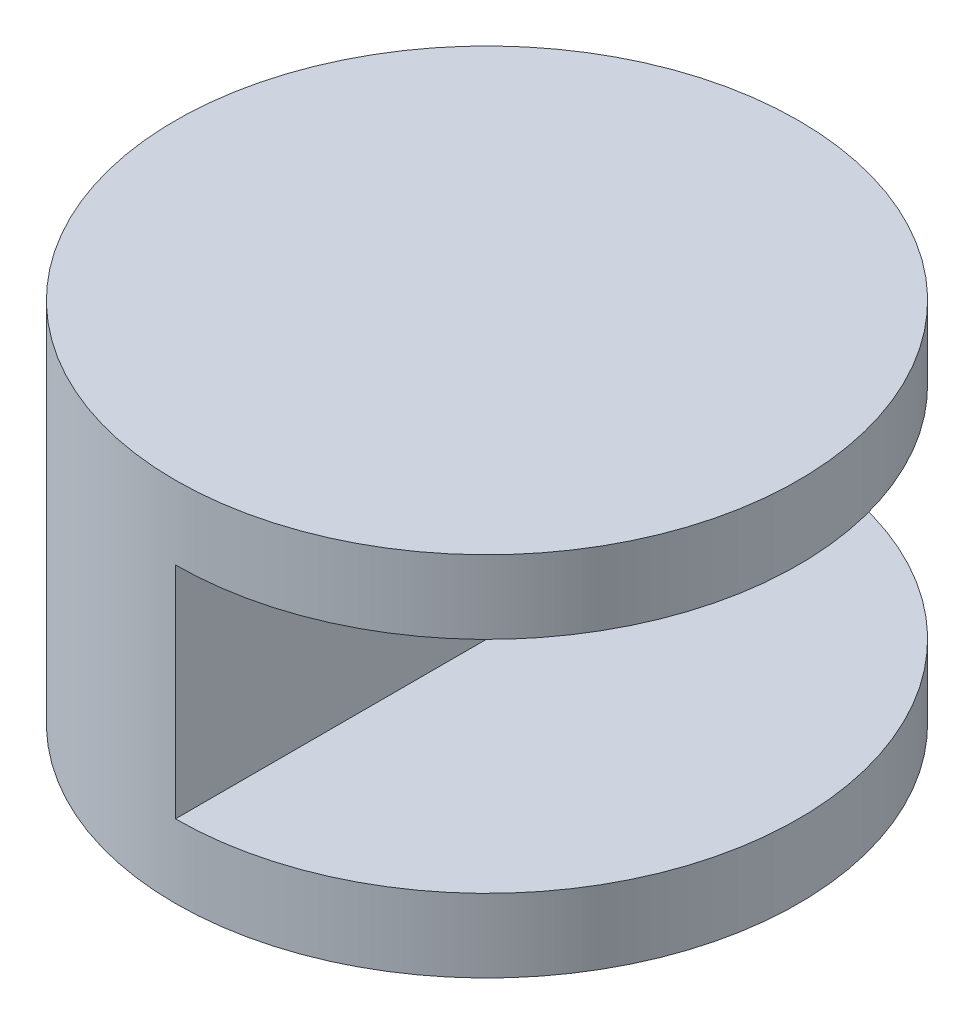
ISO-10303-21;
HEADER;
FILE_DESCRIPTION(('STEP AP214'),'2;1');
FILE_NAME('part.step','',(''),(''),'','','');
FILE_SCHEMA(('AUTOMOTIVE_DESIGN { 1 0 10303 214 1 1 1 1 }'));
ENDSEC;
DATA;
#1=APPLICATION_CONTEXT('core data for automotive mechanical design processes');
#2=APPLICATION_PROTOCOL_DEFINITION('international standard','automotive_design',2000,#1);
#3=PRODUCT_CONTEXT('',#1,'mechanical');
#4=PRODUCT('Part','Part','',(#3));
#5=PRODUCT_RELATED_PRODUCT_CATEGORY('part','',(#4));
#6=PRODUCT_DEFINITION_FORMATION('','',#4);
#7=PRODUCT_DEFINITION_CONTEXT('part definition',#1,'design');
#8=PRODUCT_DEFINITION('design','',#6,#7);
#9=PRODUCT_DEFINITION_SHAPE('','',#8);
#10=(LENGTH_UNIT() NAMED_UNIT(*) SI_UNIT(.MILLI.,.METRE.));
#11=(NAMED_UNIT(*) PLANE_ANGLE_UNIT() SI_UNIT($,.RADIAN.));
#12=(NAMED_UNIT(*) SI_UNIT($,.STERADIAN.) SOLID_ANGLE_UNIT());
#13=UNCERTAINTY_MEASURE_WITH_UNIT(LENGTH_MEASURE(1.E-05),#10,'distance_accuracy_value','');
#14=(GEOMETRIC_REPRESENTATION_CONTEXT(3) GLOBAL_UNCERTAINTY_ASSIGNED_CONTEXT((#13)) GLOBAL_UNIT_ASSIGNED_CONTEXT((#10,
#11,#12)) REPRESENTATION_CONTEXT('',''));
#15=CARTESIAN_POINT('',(0.,0.,0.));
#16=DIRECTION('',(0.,0.,1.));
#17=DIRECTION('',(1.,0.,0.));
#18=AXIS2_PLACEMENT_3D('',#15,#16,#17);
#19=CARTESIAN_POINT('',(0.,-12.7,0.));
#20=DIRECTION('',(0.,1.,0.));
#21=DIRECTION('',(0.,0.,1.));
#22=AXIS2_PLACEMENT_3D('',#19,#20,#21);
#23=CYLINDRICAL_SURFACE('',#22,10.795);
#24=DIRECTION('',(0.,1.,0.));
#25=VECTOR('',#24,1.);
#26=CARTESIAN_POINT('',(0.,-12.7,10.795));
#27=LINE('',#26,#25);
#28=CARTESIAN_POINT('',(0.,-2.54,10.795));
#29=VERTEX_POINT('',#28);
#30=CARTESIAN_POINT('',(0.,-10.16,10.795));
#31=VERTEX_POINT('',#30);
#32=EDGE_CURVE('E11',#29,#31,#27,.F.);
#33=ORIENTED_EDGE('',*,*,#32,.F.);
#34=CARTESIAN_POINT('',(0.,-2.54,0.));
#35=DIRECTION('',(0.,1.,0.));
#36=DIRECTION('',(0.,0.,1.));
#37=AXIS2_PLACEMENT_3D('',#34,#35,#36);
#38=CIRCLE('',#37,10.795);
#39=CARTESIAN_POINT('',(0.,-2.54,-10.795));
#40=VERTEX_POINT('',#39);
#41=EDGE_CURVE('E41',#40,#29,#38,.F.);
#42=ORIENTED_EDGE('',*,*,#41,.F.);
#43=DIRECTION('',(0.,1.,0.));
#44=VECTOR('',#43,1.);
#45=CARTESIAN_POINT('',(0.,-12.7,-10.795));
#46=LINE('',#45,#44);
#47=CARTESIAN_POINT('',(0.,-10.16,-10.795));
#48=VERTEX_POINT('',#47);
#49=EDGE_CURVE('E66',#48,#40,#46,.T.);
#50=ORIENTED_EDGE('',*,*,#49,.F.);
#51=CARTESIAN_POINT('',(0.,-10.16,0.));
#52=DIRECTION('',(0.,1.,0.));
#53=DIRECTION('',(0.,0.,1.));
#54=AXIS2_PLACEMENT_3D('',#51,#52,#53);
#55=CIRCLE('',#54,10.795);
#56=EDGE_CURVE('E54',#48,#31,#55,.F.);
#57=ORIENTED_EDGE('',*,*,#56,.T.);
#58=EDGE_LOOP('',(#33,#42,#50,#57));
#59=FACE_BOUND('',#58,.T.);
#60=CARTESIAN_POINT('',(0.,-12.7,0.));
#61=DIRECTION('',(0.,1.,0.));
#62=DIRECTION('',(0.,0.,1.));
#63=AXIS2_PLACEMENT_3D('',#60,#61,#62);
#64=CIRCLE('',#63,10.795);
#65=CARTESIAN_POINT('',(0.,-12.7,10.795));
#66=VERTEX_POINT('',#65);
#67=EDGE_CURVE('E74',#66,#66,#64,.T.);
#68=ORIENTED_EDGE('',*,*,#67,.T.);
#69=EDGE_LOOP('',(#68));
#70=FACE_BOUND('',#69,.T.);
#71=CARTESIAN_POINT('',(0.,0.,0.));
#72=DIRECTION('',(0.,1.,0.));
#73=DIRECTION('',(0.,0.,1.));
#74=AXIS2_PLACEMENT_3D('',#71,#72,#73);
#75=CIRCLE('',#74,10.795);
#76=CARTESIAN_POINT('',(0.,0.,10.795));
#77=VERTEX_POINT('',#76);
#78=EDGE_CURVE('E77',#77,#77,#75,.T.);
#79=ORIENTED_EDGE('',*,*,#78,.F.);
#80=EDGE_LOOP('',(#79));
#81=FACE_BOUND('',#80,.T.);
#82=ADVANCED_FACE('F34',(#59,#70,#81),#23,.T.);
#83=CARTESIAN_POINT('',(0.,-12.7,0.));
#84=DIRECTION('',(0.,1.,0.));
#85=DIRECTION('',(0.,0.,1.));
#86=AXIS2_PLACEMENT_3D('',#83,#84,#85);
#87=PLANE('',#86);
#88=ORIENTED_EDGE('',*,*,#67,.F.);
#89=EDGE_LOOP('',(#88));
#90=FACE_BOUND('',#89,.T.);
#91=ADVANCED_FACE('F70',(#90),#87,.F.);
#92=CARTESIAN_POINT('',(0.,0.,0.));
#93=DIRECTION('',(0.,1.,0.));
#94=DIRECTION('',(0.,0.,1.));
#95=AXIS2_PLACEMENT_3D('',#92,#93,#94);
#96=PLANE('',#95);
#97=ORIENTED_EDGE('',*,*,#78,.T.);
#98=EDGE_LOOP('',(#97));
#99=FACE_BOUND('',#98,.T.);
#100=ADVANCED_FACE('F84',(#99),#96,.T.);
#101=CARTESIAN_POINT('',(10.795,-2.54,13.6480910790271));
#102=DIRECTION('',(0.,1.,0.));
#103=DIRECTION('',(0.,0.,1.));
#104=AXIS2_PLACEMENT_3D('',#101,#102,#103);
#105=PLANE('',#104);
#106=ORIENTED_EDGE('',*,*,#41,.T.);
#107=DIRECTION('',(0.,0.,-1.));
#108=VECTOR('',#107,1.);
#109=CARTESIAN_POINT('',(0.,-2.54,13.6480910790271));
#110=LINE('',#109,#108);
#111=EDGE_CURVE('E64',#29,#40,#110,.T.);
#112=ORIENTED_EDGE('',*,*,#111,.T.);
#113=EDGE_LOOP('',(#106,#112));
#114=FACE_BOUND('',#113,.T.);
#115=ADVANCED_FACE('F63',(#114),#105,.F.);
#116=CARTESIAN_POINT('',(10.795,-10.16,13.6480910790271));
#117=DIRECTION('',(0.,1.,0.));
#118=DIRECTION('',(0.,0.,1.));
#119=AXIS2_PLACEMENT_3D('',#116,#117,#118);
#120=PLANE('',#119);
#121=DIRECTION('',(0.,0.,-1.));
#122=VECTOR('',#121,1.);
#123=CARTESIAN_POINT('',(0.,-10.16,13.6480910790271));
#124=LINE('',#123,#122);
#125=EDGE_CURVE('E47',#31,#48,#124,.T.);
#126=ORIENTED_EDGE('',*,*,#125,.F.);
#127=ORIENTED_EDGE('',*,*,#56,.F.);
#128=EDGE_LOOP('',(#126,#127));
#129=FACE_BOUND('',#128,.T.);
#130=ADVANCED_FACE('F90',(#129),#120,.T.);
#131=CARTESIAN_POINT('',(0.,0.,0.));
#132=DIRECTION('',(-1.,0.,0.));
#133=DIRECTION('',(0.,0.,1.));
#134=AXIS2_PLACEMENT_3D('',#131,#132,#133);
#135=PLANE('',#134);
#136=ORIENTED_EDGE('',*,*,#32,.T.);
#137=ORIENTED_EDGE('',*,*,#125,.T.);
#138=ORIENTED_EDGE('',*,*,#49,.T.);
#139=ORIENTED_EDGE('',*,*,#111,.F.);
#140=EDGE_LOOP('',(#136,#137,#138,#139));
#141=FACE_BOUND('',#140,.T.);
#142=ADVANCED_FACE('F65',(#141),#135,.F.);
#143=CLOSED_SHELL('',(#82,#91,#100,#115,#130,#142));
#144=MANIFOLD_SOLID_BREP('B2',#143);
#145=ADVANCED_BREP_SHAPE_REPRESENTATION('',(#18,#144),#14);
#146=SHAPE_DEFINITION_REPRESENTATION(#9,#145);
ENDSEC;
END-ISO-10303-21;
